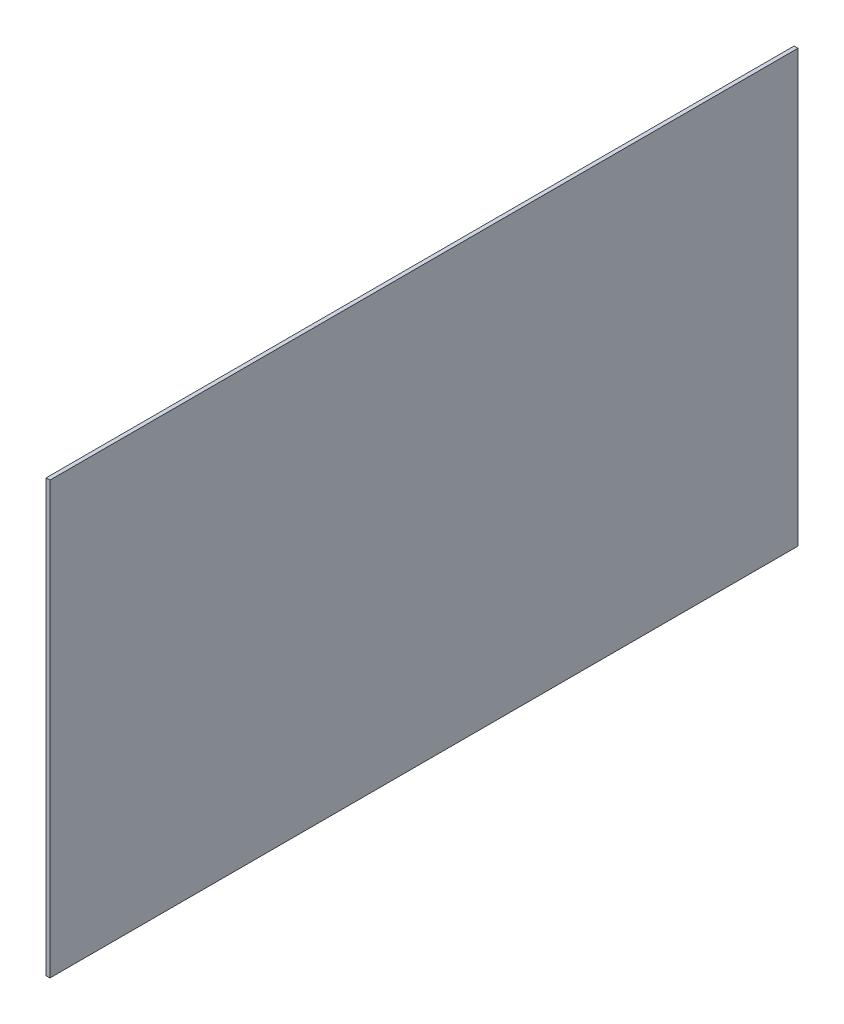
ISO-10303-21;
HEADER;
FILE_DESCRIPTION(('STEP AP214'),'2;1');
FILE_NAME('part.step','',(''),(''),'','','');
FILE_SCHEMA(('AUTOMOTIVE_DESIGN { 1 0 10303 214 1 1 1 1 }'));
ENDSEC;
DATA;
#1=APPLICATION_CONTEXT('core data for automotive mechanical design processes');
#2=APPLICATION_PROTOCOL_DEFINITION('international standard','automotive_design',2000,#1);
#3=PRODUCT_CONTEXT('',#1,'mechanical');
#4=PRODUCT('Part','Part','',(#3));
#5=PRODUCT_RELATED_PRODUCT_CATEGORY('part','',(#4));
#6=PRODUCT_DEFINITION_FORMATION('','',#4);
#7=PRODUCT_DEFINITION_CONTEXT('part definition',#1,'design');
#8=PRODUCT_DEFINITION('design','',#6,#7);
#9=PRODUCT_DEFINITION_SHAPE('','',#8);
#10=(LENGTH_UNIT() NAMED_UNIT(*) SI_UNIT(.MILLI.,.METRE.));
#11=(NAMED_UNIT(*) PLANE_ANGLE_UNIT() SI_UNIT($,.RADIAN.));
#12=(NAMED_UNIT(*) SI_UNIT($,.STERADIAN.) SOLID_ANGLE_UNIT());
#13=UNCERTAINTY_MEASURE_WITH_UNIT(LENGTH_MEASURE(1.E-05),#10,'distance_accuracy_value','');
#14=(GEOMETRIC_REPRESENTATION_CONTEXT(3) GLOBAL_UNCERTAINTY_ASSIGNED_CONTEXT((#13)) GLOBAL_UNIT_ASSIGNED_CONTEXT((#10,
#11,#12)) REPRESENTATION_CONTEXT('',''));
#15=CARTESIAN_POINT('',(0.,0.,0.));
#16=DIRECTION('',(0.,0.,1.));
#17=DIRECTION('',(1.,0.,0.));
#18=AXIS2_PLACEMENT_3D('',#15,#16,#17);
#19=CARTESIAN_POINT('',(9.525,0.,0.));
#20=DIRECTION('',(0.,0.,-1.));
#21=DIRECTION('',(-1.,0.,0.));
#22=AXIS2_PLACEMENT_3D('',#19,#20,#21);
#23=PLANE('',#22);
#24=DIRECTION('',(0.,-1.,0.));
#25=VECTOR('',#24,1.);
#26=CARTESIAN_POINT('',(0.,0.,0.));
#27=LINE('',#26,#25);
#28=CARTESIAN_POINT('',(0.,1054.1,0.));
#29=VERTEX_POINT('',#28);
#30=CARTESIAN_POINT('',(0.,0.,0.));
#31=VERTEX_POINT('',#30);
#32=EDGE_CURVE('E96',#29,#31,#27,.T.);
#33=ORIENTED_EDGE('',*,*,#32,.T.);
#34=DIRECTION('',(-1.,0.,0.));
#35=VECTOR('',#34,1.);
#36=CARTESIAN_POINT('',(9.525,0.,0.));
#37=LINE('',#36,#35);
#38=CARTESIAN_POINT('',(9.525,0.,0.));
#39=VERTEX_POINT('',#38);
#40=EDGE_CURVE('E11',#39,#31,#37,.T.);
#41=ORIENTED_EDGE('',*,*,#40,.F.);
#42=DIRECTION('',(0.,-1.,0.));
#43=VECTOR('',#42,1.);
#44=CARTESIAN_POINT('',(9.525,0.,0.));
#45=LINE('',#44,#43);
#46=CARTESIAN_POINT('',(9.525,1054.1,0.));
#47=VERTEX_POINT('',#46);
#48=EDGE_CURVE('E84',#47,#39,#45,.T.);
#49=ORIENTED_EDGE('',*,*,#48,.F.);
#50=DIRECTION('',(-1.,0.,0.));
#51=VECTOR('',#50,1.);
#52=CARTESIAN_POINT('',(9.525,1054.1,0.));
#53=LINE('',#52,#51);
#54=EDGE_CURVE('E92',#47,#29,#53,.T.);
#55=ORIENTED_EDGE('',*,*,#54,.T.);
#56=EDGE_LOOP('',(#33,#41,#49,#55));
#57=FACE_BOUND('',#56,.T.);
#58=ADVANCED_FACE('F33',(#57),#23,.F.);
#59=CARTESIAN_POINT('',(9.525,0.,0.));
#60=DIRECTION('',(0.,1.,0.));
#61=DIRECTION('',(0.,0.,1.));
#62=AXIS2_PLACEMENT_3D('',#59,#60,#61);
#63=PLANE('',#62);
#64=DIRECTION('',(0.,0.,-1.));
#65=VECTOR('',#64,1.);
#66=CARTESIAN_POINT('',(0.,0.,0.));
#67=LINE('',#66,#65);
#68=CARTESIAN_POINT('',(0.,0.,-1828.8));
#69=VERTEX_POINT('',#68);
#70=EDGE_CURVE('E88',#31,#69,#67,.T.);
#71=ORIENTED_EDGE('',*,*,#70,.T.);
#72=DIRECTION('',(-1.,0.,0.));
#73=VECTOR('',#72,1.);
#74=CARTESIAN_POINT('',(9.525,0.,-1828.8));
#75=LINE('',#74,#73);
#76=CARTESIAN_POINT('',(9.525,0.,-1828.8));
#77=VERTEX_POINT('',#76);
#78=EDGE_CURVE('E41',#77,#69,#75,.T.);
#79=ORIENTED_EDGE('',*,*,#78,.F.);
#80=DIRECTION('',(0.,0.,-1.));
#81=VECTOR('',#80,1.);
#82=CARTESIAN_POINT('',(9.525,0.,0.));
#83=LINE('',#82,#81);
#84=EDGE_CURVE('E79',#39,#77,#83,.T.);
#85=ORIENTED_EDGE('',*,*,#84,.F.);
#86=ORIENTED_EDGE('',*,*,#40,.T.);
#87=EDGE_LOOP('',(#71,#79,#85,#86));
#88=FACE_BOUND('',#87,.T.);
#89=ADVANCED_FACE('F87',(#88),#63,.F.);
#90=CARTESIAN_POINT('',(9.525,0.,-1828.8));
#91=DIRECTION('',(0.,0.,1.));
#92=DIRECTION('',(1.,0.,0.));
#93=AXIS2_PLACEMENT_3D('',#90,#91,#92);
#94=PLANE('',#93);
#95=DIRECTION('',(0.,1.,0.));
#96=VECTOR('',#95,1.);
#97=CARTESIAN_POINT('',(0.,0.,-1828.8));
#98=LINE('',#97,#96);
#99=CARTESIAN_POINT('',(0.,1054.1,-1828.8));
#100=VERTEX_POINT('',#99);
#101=EDGE_CURVE('E66',#69,#100,#98,.T.);
#102=ORIENTED_EDGE('',*,*,#101,.T.);
#103=DIRECTION('',(-1.,0.,0.));
#104=VECTOR('',#103,1.);
#105=CARTESIAN_POINT('',(9.525,1054.1,-1828.8));
#106=LINE('',#105,#104);
#107=CARTESIAN_POINT('',(9.525,1054.1,-1828.8));
#108=VERTEX_POINT('',#107);
#109=EDGE_CURVE('E89',#108,#100,#106,.T.);
#110=ORIENTED_EDGE('',*,*,#109,.F.);
#111=DIRECTION('',(0.,1.,0.));
#112=VECTOR('',#111,1.);
#113=CARTESIAN_POINT('',(9.525,0.,-1828.8));
#114=LINE('',#113,#112);
#115=EDGE_CURVE('E82',#77,#108,#114,.T.);
#116=ORIENTED_EDGE('',*,*,#115,.F.);
#117=ORIENTED_EDGE('',*,*,#78,.T.);
#118=EDGE_LOOP('',(#102,#110,#116,#117));
#119=FACE_BOUND('',#118,.T.);
#120=ADVANCED_FACE('F90',(#119),#94,.F.);
#121=CARTESIAN_POINT('',(9.525,1054.1,0.));
#122=DIRECTION('',(0.,-1.,0.));
#123=DIRECTION('',(0.,0.,-1.));
#124=AXIS2_PLACEMENT_3D('',#121,#122,#123);
#125=PLANE('',#124);
#126=DIRECTION('',(0.,0.,1.));
#127=VECTOR('',#126,1.);
#128=CARTESIAN_POINT('',(0.,1054.1,0.));
#129=LINE('',#128,#127);
#130=EDGE_CURVE('E72',#100,#29,#129,.T.);
#131=ORIENTED_EDGE('',*,*,#130,.T.);
#132=ORIENTED_EDGE('',*,*,#54,.F.);
#133=DIRECTION('',(0.,0.,1.));
#134=VECTOR('',#133,1.);
#135=CARTESIAN_POINT('',(9.525,1054.1,0.));
#136=LINE('',#135,#134);
#137=EDGE_CURVE('E49',#108,#47,#136,.T.);
#138=ORIENTED_EDGE('',*,*,#137,.F.);
#139=ORIENTED_EDGE('',*,*,#109,.T.);
#140=EDGE_LOOP('',(#131,#132,#138,#139));
#141=FACE_BOUND('',#140,.T.);
#142=ADVANCED_FACE('F103',(#141),#125,.F.);
#143=CARTESIAN_POINT('',(9.525,0.,0.));
#144=DIRECTION('',(-1.,0.,0.));
#145=DIRECTION('',(0.,0.,1.));
#146=AXIS2_PLACEMENT_3D('',#143,#144,#145);
#147=PLANE('',#146);
#148=ORIENTED_EDGE('',*,*,#48,.T.);
#149=ORIENTED_EDGE('',*,*,#84,.T.);
#150=ORIENTED_EDGE('',*,*,#115,.T.);
#151=ORIENTED_EDGE('',*,*,#137,.T.);
#152=EDGE_LOOP('',(#148,#149,#150,#151));
#153=FACE_BOUND('',#152,.T.);
#154=ADVANCED_FACE('F80',(#153),#147,.F.);
#155=CARTESIAN_POINT('',(0.,0.,0.));
#156=DIRECTION('',(-1.,0.,0.));
#157=DIRECTION('',(0.,0.,1.));
#158=AXIS2_PLACEMENT_3D('',#155,#156,#157);
#159=PLANE('',#158);
#160=ORIENTED_EDGE('',*,*,#32,.F.);
#161=ORIENTED_EDGE('',*,*,#130,.F.);
#162=ORIENTED_EDGE('',*,*,#101,.F.);
#163=ORIENTED_EDGE('',*,*,#70,.F.);
#164=EDGE_LOOP('',(#160,#161,#162,#163));
#165=FACE_BOUND('',#164,.T.);
#166=ADVANCED_FACE('F106',(#165),#159,.T.);
#167=CLOSED_SHELL('',(#58,#89,#120,#142,#154,#166));
#168=MANIFOLD_SOLID_BREP('B2',#167);
#169=ADVANCED_BREP_SHAPE_REPRESENTATION('',(#18,#168),#14);
#170=SHAPE_DEFINITION_REPRESENTATION(#9,#169);
ENDSEC;
END-ISO-10303-21;
